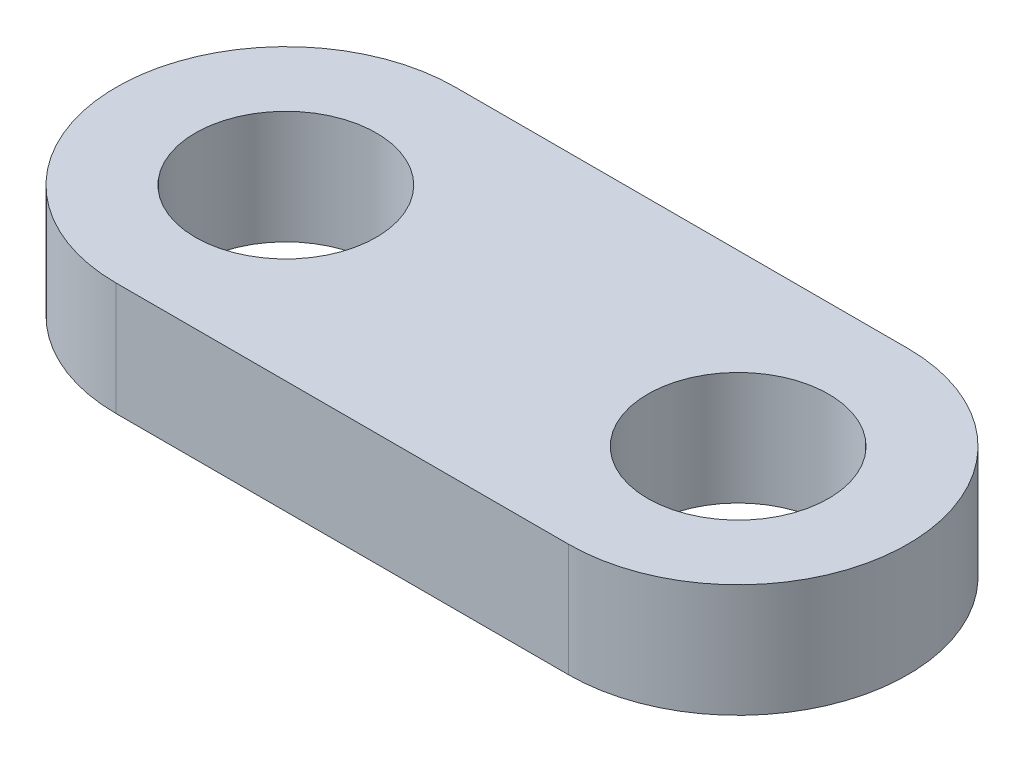
ISO-10303-21;
HEADER;
FILE_DESCRIPTION(('STEP AP214'),'2;1');
FILE_NAME('part.step','',(''),(''),'','','');
FILE_SCHEMA(('AUTOMOTIVE_DESIGN { 1 0 10303 214 1 1 1 1 }'));
ENDSEC;
DATA;
#1=APPLICATION_CONTEXT('core data for automotive mechanical design processes');
#2=APPLICATION_PROTOCOL_DEFINITION('international standard','automotive_design',2000,#1);
#3=PRODUCT_CONTEXT('',#1,'mechanical');
#4=PRODUCT('Part','Part','',(#3));
#5=PRODUCT_RELATED_PRODUCT_CATEGORY('part','',(#4));
#6=PRODUCT_DEFINITION_FORMATION('','',#4);
#7=PRODUCT_DEFINITION_CONTEXT('part definition',#1,'design');
#8=PRODUCT_DEFINITION('design','',#6,#7);
#9=PRODUCT_DEFINITION_SHAPE('','',#8);
#10=(LENGTH_UNIT() NAMED_UNIT(*) SI_UNIT(.MILLI.,.METRE.));
#11=(NAMED_UNIT(*) PLANE_ANGLE_UNIT() SI_UNIT($,.RADIAN.));
#12=(NAMED_UNIT(*) SI_UNIT($,.STERADIAN.) SOLID_ANGLE_UNIT());
#13=UNCERTAINTY_MEASURE_WITH_UNIT(LENGTH_MEASURE(1.E-05),#10,'distance_accuracy_value','');
#14=(GEOMETRIC_REPRESENTATION_CONTEXT(3) GLOBAL_UNCERTAINTY_ASSIGNED_CONTEXT((#13)) GLOBAL_UNIT_ASSIGNED_CONTEXT((#10,
#11,#12)) REPRESENTATION_CONTEXT('',''));
#15=CARTESIAN_POINT('',(0.,0.,0.));
#16=DIRECTION('',(0.,0.,1.));
#17=DIRECTION('',(1.,0.,0.));
#18=AXIS2_PLACEMENT_3D('',#15,#16,#17);
#19=CARTESIAN_POINT('',(-10.,5.,0.));
#20=DIRECTION('',(0.,1.,0.));
#21=DIRECTION('',(0.,0.,1.));
#22=AXIS2_PLACEMENT_3D('',#19,#20,#21);
#23=PLANE('',#22);
#24=CARTESIAN_POINT('',(-10.,5.,0.));
#25=DIRECTION('',(0.,1.,0.));
#26=DIRECTION('',(0.,0.,1.));
#27=AXIS2_PLACEMENT_3D('',#24,#25,#26);
#28=CIRCLE('',#27,4.);
#29=CARTESIAN_POINT('',(-10.,5.,4.));
#30=VERTEX_POINT('',#29);
#31=EDGE_CURVE('E103',#30,#30,#28,.T.);
#32=ORIENTED_EDGE('',*,*,#31,.F.);
#33=EDGE_LOOP('',(#32));
#34=FACE_BOUND('',#33,.T.);
#35=CARTESIAN_POINT('',(-10.,5.,0.));
#36=DIRECTION('',(0.,1.,0.));
#37=DIRECTION('',(0.,0.,1.));
#38=AXIS2_PLACEMENT_3D('',#35,#36,#37);
#39=CIRCLE('',#38,7.5);
#40=CARTESIAN_POINT('',(-10.,5.,-7.5));
#41=VERTEX_POINT('',#40);
#42=CARTESIAN_POINT('',(-10.,5.,7.5));
#43=VERTEX_POINT('',#42);
#44=EDGE_CURVE('E88',#41,#43,#39,.T.);
#45=ORIENTED_EDGE('',*,*,#44,.T.);
#46=DIRECTION('',(1.,0.,0.));
#47=VECTOR('',#46,1.);
#48=CARTESIAN_POINT('',(-10.,5.,7.5));
#49=LINE('',#48,#47);
#50=CARTESIAN_POINT('',(10.,5.,7.5));
#51=VERTEX_POINT('',#50);
#52=EDGE_CURVE('E83',#43,#51,#49,.T.);
#53=ORIENTED_EDGE('',*,*,#52,.T.);
#54=CARTESIAN_POINT('',(10.,5.,0.));
#55=DIRECTION('',(0.,1.,0.));
#56=DIRECTION('',(0.,0.,1.));
#57=AXIS2_PLACEMENT_3D('',#54,#55,#56);
#58=CIRCLE('',#57,7.5);
#59=CARTESIAN_POINT('',(10.,5.,-7.50000000000001));
#60=VERTEX_POINT('',#59);
#61=EDGE_CURVE('E86',#51,#60,#58,.T.);
#62=ORIENTED_EDGE('',*,*,#61,.T.);
#63=DIRECTION('',(-1.,0.,0.));
#64=VECTOR('',#63,1.);
#65=CARTESIAN_POINT('',(-10.,5.,-7.5));
#66=LINE('',#65,#64);
#67=EDGE_CURVE('E53',#60,#41,#66,.T.);
#68=ORIENTED_EDGE('',*,*,#67,.T.);
#69=EDGE_LOOP('',(#45,#53,#62,#68));
#70=FACE_BOUND('',#69,.T.);
#71=CARTESIAN_POINT('',(10.,5.,0.));
#72=DIRECTION('',(0.,1.,0.));
#73=DIRECTION('',(0.,0.,1.));
#74=AXIS2_PLACEMENT_3D('',#71,#72,#73);
#75=CIRCLE('',#74,4.);
#76=CARTESIAN_POINT('',(10.,5.,4.));
#77=VERTEX_POINT('',#76);
#78=EDGE_CURVE('E118',#77,#77,#75,.T.);
#79=ORIENTED_EDGE('',*,*,#78,.F.);
#80=EDGE_LOOP('',(#79));
#81=FACE_BOUND('',#80,.T.);
#82=ADVANCED_FACE('F36',(#34,#70,#81),#23,.T.);
#83=CARTESIAN_POINT('',(-10.,0.,0.));
#84=DIRECTION('',(0.,1.,0.));
#85=DIRECTION('',(0.,0.,1.));
#86=AXIS2_PLACEMENT_3D('',#83,#84,#85);
#87=PLANE('',#86);
#88=CARTESIAN_POINT('',(-10.,0.,0.));
#89=DIRECTION('',(0.,1.,0.));
#90=DIRECTION('',(0.,0.,1.));
#91=AXIS2_PLACEMENT_3D('',#88,#89,#90);
#92=CIRCLE('',#91,7.5);
#93=CARTESIAN_POINT('',(-10.,0.,-7.5));
#94=VERTEX_POINT('',#93);
#95=CARTESIAN_POINT('',(-10.,0.,7.5));
#96=VERTEX_POINT('',#95);
#97=EDGE_CURVE('E100',#94,#96,#92,.T.);
#98=ORIENTED_EDGE('',*,*,#97,.F.);
#99=DIRECTION('',(-1.,0.,0.));
#100=VECTOR('',#99,1.);
#101=CARTESIAN_POINT('',(-10.,0.,-7.5));
#102=LINE('',#101,#100);
#103=CARTESIAN_POINT('',(10.,0.,-7.50000000000001));
#104=VERTEX_POINT('',#103);
#105=EDGE_CURVE('E76',#104,#94,#102,.T.);
#106=ORIENTED_EDGE('',*,*,#105,.F.);
#107=CARTESIAN_POINT('',(10.,0.,0.));
#108=DIRECTION('',(0.,1.,0.));
#109=DIRECTION('',(0.,0.,1.));
#110=AXIS2_PLACEMENT_3D('',#107,#108,#109);
#111=CIRCLE('',#110,7.5);
#112=CARTESIAN_POINT('',(10.,0.,7.5));
#113=VERTEX_POINT('',#112);
#114=EDGE_CURVE('E70',#113,#104,#111,.T.);
#115=ORIENTED_EDGE('',*,*,#114,.F.);
#116=DIRECTION('',(1.,0.,0.));
#117=VECTOR('',#116,1.);
#118=CARTESIAN_POINT('',(-10.,0.,7.5));
#119=LINE('',#118,#117);
#120=EDGE_CURVE('E92',#96,#113,#119,.T.);
#121=ORIENTED_EDGE('',*,*,#120,.F.);
#122=EDGE_LOOP('',(#98,#106,#115,#121));
#123=FACE_BOUND('',#122,.T.);
#124=CARTESIAN_POINT('',(-10.,0.,0.));
#125=DIRECTION('',(0.,1.,0.));
#126=DIRECTION('',(0.,0.,1.));
#127=AXIS2_PLACEMENT_3D('',#124,#125,#126);
#128=CIRCLE('',#127,4.);
#129=CARTESIAN_POINT('',(-10.,0.,4.));
#130=VERTEX_POINT('',#129);
#131=EDGE_CURVE('E115',#130,#130,#128,.T.);
#132=ORIENTED_EDGE('',*,*,#131,.T.);
#133=EDGE_LOOP('',(#132));
#134=FACE_BOUND('',#133,.T.);
#135=CARTESIAN_POINT('',(10.,0.,0.));
#136=DIRECTION('',(0.,1.,0.));
#137=DIRECTION('',(0.,0.,1.));
#138=AXIS2_PLACEMENT_3D('',#135,#136,#137);
#139=CIRCLE('',#138,4.);
#140=CARTESIAN_POINT('',(10.,0.,4.));
#141=VERTEX_POINT('',#140);
#142=EDGE_CURVE('E121',#141,#141,#139,.T.);
#143=ORIENTED_EDGE('',*,*,#142,.T.);
#144=EDGE_LOOP('',(#143));
#145=FACE_BOUND('',#144,.T.);
#146=ADVANCED_FACE('F111',(#123,#134,#145),#87,.F.);
#147=CARTESIAN_POINT('',(-10.,5.,0.));
#148=DIRECTION('',(0.,-1.,0.));
#149=DIRECTION('',(0.,0.,-1.));
#150=AXIS2_PLACEMENT_3D('',#147,#148,#149);
#151=CYLINDRICAL_SURFACE('',#150,7.5);
#152=ORIENTED_EDGE('',*,*,#97,.T.);
#153=DIRECTION('',(0.,-1.,0.));
#154=VECTOR('',#153,1.);
#155=CARTESIAN_POINT('',(-10.,5.,7.5));
#156=LINE('',#155,#154);
#157=EDGE_CURVE('E11',#43,#96,#156,.T.);
#158=ORIENTED_EDGE('',*,*,#157,.F.);
#159=ORIENTED_EDGE('',*,*,#44,.F.);
#160=DIRECTION('',(0.,-1.,0.));
#161=VECTOR('',#160,1.);
#162=CARTESIAN_POINT('',(-10.,5.,-7.5));
#163=LINE('',#162,#161);
#164=EDGE_CURVE('E96',#41,#94,#163,.T.);
#165=ORIENTED_EDGE('',*,*,#164,.T.);
#166=EDGE_LOOP('',(#152,#158,#159,#165));
#167=FACE_BOUND('',#166,.T.);
#168=ADVANCED_FACE('F38',(#167),#151,.T.);
#169=CARTESIAN_POINT('',(-10.,5.,7.5));
#170=DIRECTION('',(0.,0.,-1.));
#171=DIRECTION('',(-1.,0.,0.));
#172=AXIS2_PLACEMENT_3D('',#169,#170,#171);
#173=PLANE('',#172);
#174=ORIENTED_EDGE('',*,*,#120,.T.);
#175=DIRECTION('',(0.,-1.,0.));
#176=VECTOR('',#175,1.);
#177=CARTESIAN_POINT('',(10.,5.,7.5));
#178=LINE('',#177,#176);
#179=EDGE_CURVE('E45',#51,#113,#178,.T.);
#180=ORIENTED_EDGE('',*,*,#179,.F.);
#181=ORIENTED_EDGE('',*,*,#52,.F.);
#182=ORIENTED_EDGE('',*,*,#157,.T.);
#183=EDGE_LOOP('',(#174,#180,#181,#182));
#184=FACE_BOUND('',#183,.T.);
#185=ADVANCED_FACE('F91',(#184),#173,.F.);
#186=CARTESIAN_POINT('',(10.,5.,0.));
#187=DIRECTION('',(0.,-1.,0.));
#188=DIRECTION('',(0.,0.,-1.));
#189=AXIS2_PLACEMENT_3D('',#186,#187,#188);
#190=CYLINDRICAL_SURFACE('',#189,7.5);
#191=ORIENTED_EDGE('',*,*,#114,.T.);
#192=DIRECTION('',(0.,-1.,0.));
#193=VECTOR('',#192,1.);
#194=CARTESIAN_POINT('',(10.,5.,-7.50000000000001));
#195=LINE('',#194,#193);
#196=EDGE_CURVE('E93',#60,#104,#195,.T.);
#197=ORIENTED_EDGE('',*,*,#196,.F.);
#198=ORIENTED_EDGE('',*,*,#61,.F.);
#199=ORIENTED_EDGE('',*,*,#179,.T.);
#200=EDGE_LOOP('',(#191,#197,#198,#199));
#201=FACE_BOUND('',#200,.T.);
#202=ADVANCED_FACE('F94',(#201),#190,.T.);
#203=CARTESIAN_POINT('',(-10.,5.,-7.5));
#204=DIRECTION('',(0.,0.,1.));
#205=DIRECTION('',(1.,0.,0.));
#206=AXIS2_PLACEMENT_3D('',#203,#204,#205);
#207=PLANE('',#206);
#208=ORIENTED_EDGE('',*,*,#105,.T.);
#209=ORIENTED_EDGE('',*,*,#164,.F.);
#210=ORIENTED_EDGE('',*,*,#67,.F.);
#211=ORIENTED_EDGE('',*,*,#196,.T.);
#212=EDGE_LOOP('',(#208,#209,#210,#211));
#213=FACE_BOUND('',#212,.T.);
#214=ADVANCED_FACE('F108',(#213),#207,.F.);
#215=CARTESIAN_POINT('',(-10.,5.,0.));
#216=DIRECTION('',(0.,-1.,0.));
#217=DIRECTION('',(0.,0.,-1.));
#218=AXIS2_PLACEMENT_3D('',#215,#216,#217);
#219=CYLINDRICAL_SURFACE('',#218,4.);
#220=ORIENTED_EDGE('',*,*,#31,.T.);
#221=EDGE_LOOP('',(#220));
#222=FACE_BOUND('',#221,.T.);
#223=ORIENTED_EDGE('',*,*,#131,.F.);
#224=EDGE_LOOP('',(#223));
#225=FACE_BOUND('',#224,.T.);
#226=ADVANCED_FACE('F138',(#222,#225),#219,.F.);
#227=CARTESIAN_POINT('',(10.,5.,0.));
#228=DIRECTION('',(0.,-1.,0.));
#229=DIRECTION('',(0.,0.,-1.));
#230=AXIS2_PLACEMENT_3D('',#227,#228,#229);
#231=CYLINDRICAL_SURFACE('',#230,4.);
#232=ORIENTED_EDGE('',*,*,#78,.T.);
#233=EDGE_LOOP('',(#232));
#234=FACE_BOUND('',#233,.T.);
#235=ORIENTED_EDGE('',*,*,#142,.F.);
#236=EDGE_LOOP('',(#235));
#237=FACE_BOUND('',#236,.T.);
#238=ADVANCED_FACE('F127',(#234,#237),#231,.F.);
#239=CLOSED_SHELL('',(#82,#146,#168,#185,#202,#214,#226,#238));
#240=MANIFOLD_SOLID_BREP('B2',#239);
#241=ADVANCED_BREP_SHAPE_REPRESENTATION('',(#18,#240),#14);
#242=SHAPE_DEFINITION_REPRESENTATION(#9,#241);
ENDSEC;
END-ISO-10303-21;
